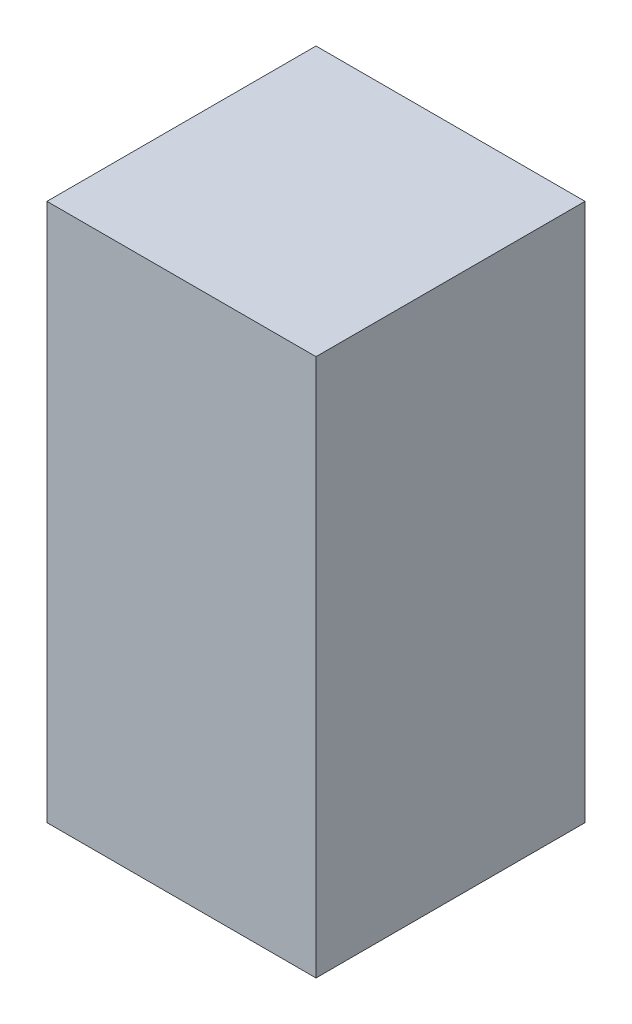
ISO-10303-21;
HEADER;
FILE_DESCRIPTION(('STEP AP214'),'2;1');
FILE_NAME('part.step','',(''),(''),'','','');
FILE_SCHEMA(('AUTOMOTIVE_DESIGN { 1 0 10303 214 1 1 1 1 }'));
ENDSEC;
DATA;
#1=APPLICATION_CONTEXT('core data for automotive mechanical design processes');
#2=APPLICATION_PROTOCOL_DEFINITION('international standard','automotive_design',2000,#1);
#3=PRODUCT_CONTEXT('',#1,'mechanical');
#4=PRODUCT('Part','Part','',(#3));
#5=PRODUCT_RELATED_PRODUCT_CATEGORY('part','',(#4));
#6=PRODUCT_DEFINITION_FORMATION('','',#4);
#7=PRODUCT_DEFINITION_CONTEXT('part definition',#1,'design');
#8=PRODUCT_DEFINITION('design','',#6,#7);
#9=PRODUCT_DEFINITION_SHAPE('','',#8);
#10=(LENGTH_UNIT() NAMED_UNIT(*) SI_UNIT(.MILLI.,.METRE.));
#11=(NAMED_UNIT(*) PLANE_ANGLE_UNIT() SI_UNIT($,.RADIAN.));
#12=(NAMED_UNIT(*) SI_UNIT($,.STERADIAN.) SOLID_ANGLE_UNIT());
#13=UNCERTAINTY_MEASURE_WITH_UNIT(LENGTH_MEASURE(1.E-05),#10,'distance_accuracy_value','');
#14=(GEOMETRIC_REPRESENTATION_CONTEXT(3) GLOBAL_UNCERTAINTY_ASSIGNED_CONTEXT((#13)) GLOBAL_UNIT_ASSIGNED_CONTEXT((#10,
#11,#12)) REPRESENTATION_CONTEXT('',''));
#15=CARTESIAN_POINT('',(0.,0.,0.));
#16=DIRECTION('',(0.,0.,1.));
#17=DIRECTION('',(1.,0.,0.));
#18=AXIS2_PLACEMENT_3D('',#15,#16,#17);
#19=CARTESIAN_POINT('',(150.,600.,150.));
#20=DIRECTION('',(-1.,0.,0.));
#21=DIRECTION('',(0.,0.,1.));
#22=AXIS2_PLACEMENT_3D('',#19,#20,#21);
#23=PLANE('',#22);
#24=DIRECTION('',(0.,0.,-1.));
#25=VECTOR('',#24,1.);
#26=CARTESIAN_POINT('',(150.,0.,150.));
#27=LINE('',#26,#25);
#28=CARTESIAN_POINT('',(150.,0.,150.));
#29=VERTEX_POINT('',#28);
#30=CARTESIAN_POINT('',(150.,0.,-150.));
#31=VERTEX_POINT('',#30);
#32=EDGE_CURVE('E109',#29,#31,#27,.T.);
#33=ORIENTED_EDGE('',*,*,#32,.T.);
#34=DIRECTION('',(0.,-1.,0.));
#35=VECTOR('',#34,1.);
#36=CARTESIAN_POINT('',(150.,600.,-150.));
#37=LINE('',#36,#35);
#38=CARTESIAN_POINT('',(150.,600.,-150.));
#39=VERTEX_POINT('',#38);
#40=EDGE_CURVE('E11',#39,#31,#37,.T.);
#41=ORIENTED_EDGE('',*,*,#40,.F.);
#42=DIRECTION('',(0.,0.,-1.));
#43=VECTOR('',#42,1.);
#44=CARTESIAN_POINT('',(150.,600.,150.));
#45=LINE('',#44,#43);
#46=CARTESIAN_POINT('',(150.,600.,150.));
#47=VERTEX_POINT('',#46);
#48=EDGE_CURVE('E93',#47,#39,#45,.T.);
#49=ORIENTED_EDGE('',*,*,#48,.F.);
#50=DIRECTION('',(0.,-1.,0.));
#51=VECTOR('',#50,1.);
#52=CARTESIAN_POINT('',(150.,600.,150.));
#53=LINE('',#52,#51);
#54=EDGE_CURVE('E105',#47,#29,#53,.T.);
#55=ORIENTED_EDGE('',*,*,#54,.T.);
#56=EDGE_LOOP('',(#33,#41,#49,#55));
#57=FACE_BOUND('',#56,.T.);
#58=ADVANCED_FACE('F41',(#57),#23,.F.);
#59=CARTESIAN_POINT('',(-150.,600.,-150.));
#60=DIRECTION('',(0.,0.,1.));
#61=DIRECTION('',(1.,0.,0.));
#62=AXIS2_PLACEMENT_3D('',#59,#60,#61);
#63=PLANE('',#62);
#64=DIRECTION('',(-1.,0.,0.));
#65=VECTOR('',#64,1.);
#66=CARTESIAN_POINT('',(-150.,0.,-150.));
#67=LINE('',#66,#65);
#68=CARTESIAN_POINT('',(-150.,0.,-150.));
#69=VERTEX_POINT('',#68);
#70=EDGE_CURVE('E98',#31,#69,#67,.T.);
#71=ORIENTED_EDGE('',*,*,#70,.T.);
#72=DIRECTION('',(0.,-1.,0.));
#73=VECTOR('',#72,1.);
#74=CARTESIAN_POINT('',(-150.,600.,-150.));
#75=LINE('',#74,#73);
#76=CARTESIAN_POINT('',(-150.,600.,-150.));
#77=VERTEX_POINT('',#76);
#78=EDGE_CURVE('E50',#77,#69,#75,.T.);
#79=ORIENTED_EDGE('',*,*,#78,.F.);
#80=DIRECTION('',(-1.,0.,0.));
#81=VECTOR('',#80,1.);
#82=CARTESIAN_POINT('',(-150.,600.,-150.));
#83=LINE('',#82,#81);
#84=EDGE_CURVE('E88',#39,#77,#83,.T.);
#85=ORIENTED_EDGE('',*,*,#84,.F.);
#86=ORIENTED_EDGE('',*,*,#40,.T.);
#87=EDGE_LOOP('',(#71,#79,#85,#86));
#88=FACE_BOUND('',#87,.T.);
#89=ADVANCED_FACE('F97',(#88),#63,.F.);
#90=CARTESIAN_POINT('',(-150.,600.,150.));
#91=DIRECTION('',(1.,0.,0.));
#92=DIRECTION('',(0.,0.,-1.));
#93=AXIS2_PLACEMENT_3D('',#90,#91,#92);
#94=PLANE('',#93);
#95=DIRECTION('',(0.,0.,1.));
#96=VECTOR('',#95,1.);
#97=CARTESIAN_POINT('',(-150.,0.,150.));
#98=LINE('',#97,#96);
#99=CARTESIAN_POINT('',(-150.,0.,150.));
#100=VERTEX_POINT('',#99);
#101=EDGE_CURVE('E75',#69,#100,#98,.T.);
#102=ORIENTED_EDGE('',*,*,#101,.T.);
#103=DIRECTION('',(0.,-1.,0.));
#104=VECTOR('',#103,1.);
#105=CARTESIAN_POINT('',(-150.,600.,150.));
#106=LINE('',#105,#104);
#107=CARTESIAN_POINT('',(-150.,600.,150.));
#108=VERTEX_POINT('',#107);
#109=EDGE_CURVE('E100',#108,#100,#106,.T.);
#110=ORIENTED_EDGE('',*,*,#109,.F.);
#111=DIRECTION('',(0.,0.,1.));
#112=VECTOR('',#111,1.);
#113=CARTESIAN_POINT('',(-150.,600.,150.));
#114=LINE('',#113,#112);
#115=EDGE_CURVE('E91',#77,#108,#114,.T.);
#116=ORIENTED_EDGE('',*,*,#115,.F.);
#117=ORIENTED_EDGE('',*,*,#78,.T.);
#118=EDGE_LOOP('',(#102,#110,#116,#117));
#119=FACE_BOUND('',#118,.T.);
#120=ADVANCED_FACE('F101',(#119),#94,.F.);
#121=CARTESIAN_POINT('',(-150.,600.,150.));
#122=DIRECTION('',(0.,0.,-1.));
#123=DIRECTION('',(-1.,0.,0.));
#124=AXIS2_PLACEMENT_3D('',#121,#122,#123);
#125=PLANE('',#124);
#126=DIRECTION('',(1.,0.,0.));
#127=VECTOR('',#126,1.);
#128=CARTESIAN_POINT('',(-150.,0.,150.));
#129=LINE('',#128,#127);
#130=EDGE_CURVE('E81',#100,#29,#129,.T.);
#131=ORIENTED_EDGE('',*,*,#130,.T.);
#132=ORIENTED_EDGE('',*,*,#54,.F.);
#133=DIRECTION('',(1.,0.,0.));
#134=VECTOR('',#133,1.);
#135=CARTESIAN_POINT('',(-150.,600.,150.));
#136=LINE('',#135,#134);
#137=EDGE_CURVE('E58',#108,#47,#136,.T.);
#138=ORIENTED_EDGE('',*,*,#137,.F.);
#139=ORIENTED_EDGE('',*,*,#109,.T.);
#140=EDGE_LOOP('',(#131,#132,#138,#139));
#141=FACE_BOUND('',#140,.T.);
#142=ADVANCED_FACE('F123',(#141),#125,.F.);
#143=CARTESIAN_POINT('',(0.,600.,0.));
#144=DIRECTION('',(0.,-1.,0.));
#145=DIRECTION('',(0.,0.,-1.));
#146=AXIS2_PLACEMENT_3D('',#143,#144,#145);
#147=PLANE('',#146);
#148=ORIENTED_EDGE('',*,*,#48,.T.);
#149=ORIENTED_EDGE('',*,*,#84,.T.);
#150=ORIENTED_EDGE('',*,*,#115,.T.);
#151=ORIENTED_EDGE('',*,*,#137,.T.);
#152=EDGE_LOOP('',(#148,#149,#150,#151));
#153=FACE_BOUND('',#152,.T.);
#154=ADVANCED_FACE('F89',(#153),#147,.F.);
#155=CARTESIAN_POINT('',(0.,0.,0.));
#156=DIRECTION('',(0.,-1.,0.));
#157=DIRECTION('',(0.,0.,-1.));
#158=AXIS2_PLACEMENT_3D('',#155,#156,#157);
#159=PLANE('',#158);
#160=CARTESIAN_POINT('',(0.,0.,0.));
#161=DIRECTION('',(0.,-1.,0.));
#162=DIRECTION('',(0.,0.,-1.));
#163=AXIS2_PLACEMENT_3D('',#160,#161,#162);
#164=CIRCLE('',#163,142.6010694);
#165=CARTESIAN_POINT('',(0.,0.,-142.6010694));
#166=VERTEX_POINT('',#165);
#167=EDGE_CURVE('E130',#166,#166,#164,.T.);
#168=ORIENTED_EDGE('',*,*,#167,.F.);
#169=EDGE_LOOP('',(#168));
#170=FACE_BOUND('',#169,.T.);
#171=ORIENTED_EDGE('',*,*,#32,.F.);
#172=ORIENTED_EDGE('',*,*,#130,.F.);
#173=ORIENTED_EDGE('',*,*,#101,.F.);
#174=ORIENTED_EDGE('',*,*,#70,.F.);
#175=EDGE_LOOP('',(#171,#172,#173,#174));
#176=FACE_BOUND('',#175,.T.);
#177=ADVANCED_FACE('F126',(#170,#176),#159,.T.);
#178=CARTESIAN_POINT('',(0.,142.6,0.));
#179=DIRECTION('',(0.,-1.,0.));
#180=DIRECTION('',(0.,0.,-1.));
#181=AXIS2_PLACEMENT_3D('',#178,#179,#180);
#182=CYLINDRICAL_SURFACE('',#181,142.6010694);
#183=CARTESIAN_POINT('',(0.,142.6,0.));
#184=DIRECTION('',(0.,-1.,0.));
#185=DIRECTION('',(0.,0.,-1.));
#186=AXIS2_PLACEMENT_3D('',#183,#184,#185);
#187=CIRCLE('',#186,142.6010694);
#188=CARTESIAN_POINT('',(0.,142.6,-142.6010694));
#189=VERTEX_POINT('',#188);
#190=EDGE_CURVE('E113',#189,#189,#187,.T.);
#191=ORIENTED_EDGE('',*,*,#190,.F.);
#192=EDGE_LOOP('',(#191));
#193=FACE_BOUND('',#192,.T.);
#194=ORIENTED_EDGE('',*,*,#167,.T.);
#195=EDGE_LOOP('',(#194));
#196=FACE_BOUND('',#195,.T.);
#197=ADVANCED_FACE('F140',(#193,#196),#182,.F.);
#198=CARTESIAN_POINT('',(0.,142.6,0.));
#199=DIRECTION('',(0.,0.,-1.));
#200=DIRECTION('',(1.,0.,0.));
#201=AXIS2_PLACEMENT_3D('',#198,#199,#200);
#202=SPHERICAL_SURFACE('',#201,142.601069387385);
#203=CARTESIAN_POINT('',(0.,142.6,0.));
#204=DIRECTION('',(0.,-1.,0.));
#205=DIRECTION('',(0.,0.,-1.));
#206=AXIS2_PLACEMENT_3D('',#203,#204,#205);
#207=SPHERICAL_SURFACE('',#206,142.601069387385);
#208=ORIENTED_EDGE('',*,*,#190,.T.);
#209=EDGE_LOOP('',(#208));
#210=FACE_BOUND('',#209,.T.);
#211=ADVANCED_FACE('F138',(#210),#207,.T.);
#212=CLOSED_SHELL('',(#58,#89,#120,#142,#154,#177,#197,#211));
#213=MANIFOLD_SOLID_BREP('B2',#212);
#214=ADVANCED_BREP_SHAPE_REPRESENTATION('',(#18,#213),#14);
#215=SHAPE_DEFINITION_REPRESENTATION(#9,#214);
ENDSEC;
END-ISO-10303-21;
